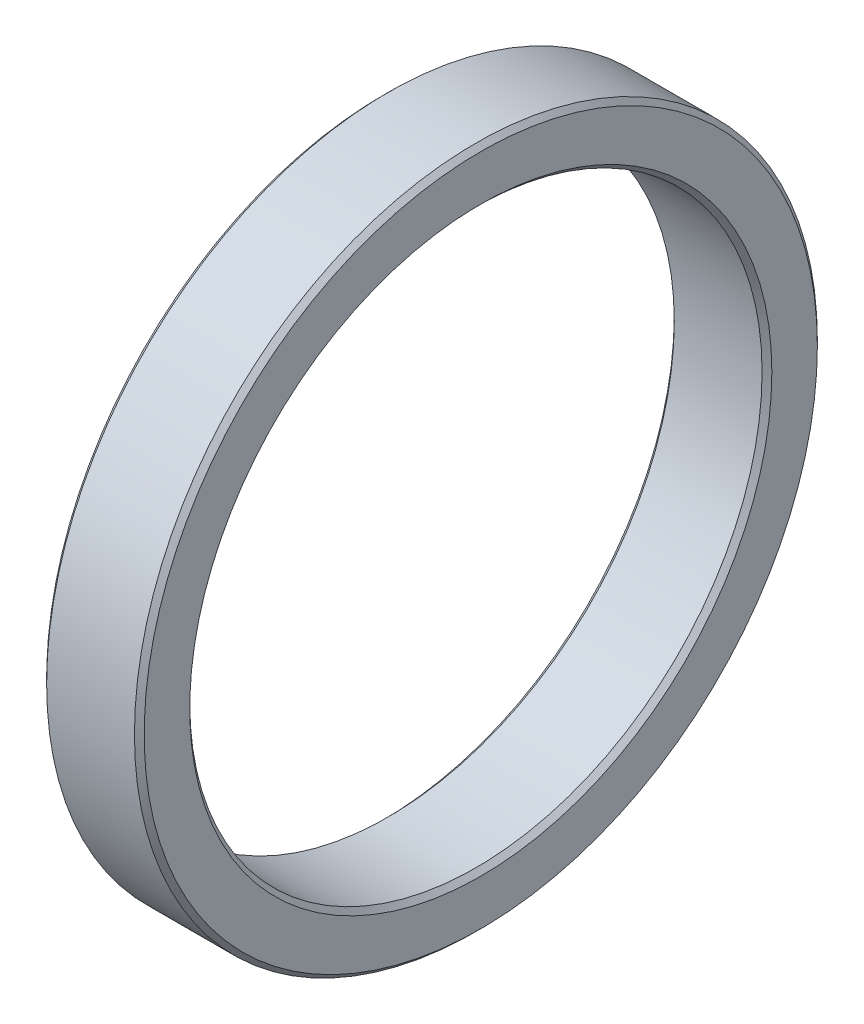
ISO-10303-21;
HEADER;
FILE_DESCRIPTION(('STEP AP214'),'2;1');
FILE_NAME('part.step','',(''),(''),'','','');
FILE_SCHEMA(('AUTOMOTIVE_DESIGN { 1 0 10303 214 1 1 1 1 }'));
ENDSEC;
DATA;
#1=APPLICATION_CONTEXT('core data for automotive mechanical design processes');
#2=APPLICATION_PROTOCOL_DEFINITION('international standard','automotive_design',2000,#1);
#3=PRODUCT_CONTEXT('',#1,'mechanical');
#4=PRODUCT('Part','Part','',(#3));
#5=PRODUCT_RELATED_PRODUCT_CATEGORY('part','',(#4));
#6=PRODUCT_DEFINITION_FORMATION('','',#4);
#7=PRODUCT_DEFINITION_CONTEXT('part definition',#1,'design');
#8=PRODUCT_DEFINITION('design','',#6,#7);
#9=PRODUCT_DEFINITION_SHAPE('','',#8);
#10=(LENGTH_UNIT() NAMED_UNIT(*) SI_UNIT(.MILLI.,.METRE.));
#11=(NAMED_UNIT(*) PLANE_ANGLE_UNIT() SI_UNIT($,.RADIAN.));
#12=(NAMED_UNIT(*) SI_UNIT($,.STERADIAN.) SOLID_ANGLE_UNIT());
#13=UNCERTAINTY_MEASURE_WITH_UNIT(LENGTH_MEASURE(1.E-05),#10,'distance_accuracy_value','');
#14=(GEOMETRIC_REPRESENTATION_CONTEXT(3) GLOBAL_UNCERTAINTY_ASSIGNED_CONTEXT((#13)) GLOBAL_UNIT_ASSIGNED_CONTEXT((#10,
#11,#12)) REPRESENTATION_CONTEXT('',''));
#15=CARTESIAN_POINT('',(0.,0.,0.));
#16=DIRECTION('',(0.,0.,1.));
#17=DIRECTION('',(1.,0.,0.));
#18=AXIS2_PLACEMENT_3D('',#15,#16,#17);
#19=CARTESIAN_POINT('',(6.,0.,0.));
#20=DIRECTION('',(1.,0.,0.));
#21=DIRECTION('',(0.,0.,-1.));
#22=AXIS2_PLACEMENT_3D('',#19,#20,#21);
#23=PLANE('',#22);
#24=CARTESIAN_POINT('',(6.,0.,0.));
#25=DIRECTION('',(1.,0.,0.));
#26=DIRECTION('',(0.,0.,-1.));
#27=AXIS2_PLACEMENT_3D('',#24,#25,#26);
#28=CIRCLE('',#27,17.9);
#29=CARTESIAN_POINT('',(6.,0.,-17.9));
#30=VERTEX_POINT('',#29);
#31=EDGE_CURVE('E47',#30,#30,#28,.F.);
#32=ORIENTED_EDGE('',*,*,#31,.T.);
#33=EDGE_LOOP('',(#32));
#34=FACE_BOUND('',#33,.T.);
#35=CARTESIAN_POINT('',(6.,0.,0.));
#36=DIRECTION('',(1.,0.,0.));
#37=DIRECTION('',(0.,0.,-1.));
#38=AXIS2_PLACEMENT_3D('',#35,#36,#37);
#39=CIRCLE('',#38,20.7);
#40=CARTESIAN_POINT('',(6.,0.,-20.7));
#41=VERTEX_POINT('',#40);
#42=EDGE_CURVE('E51',#41,#41,#39,.T.);
#43=ORIENTED_EDGE('',*,*,#42,.T.);
#44=EDGE_LOOP('',(#43));
#45=FACE_BOUND('',#44,.T.);
#46=ADVANCED_FACE('F35',(#34,#45),#23,.T.);
#47=CARTESIAN_POINT('',(0.,0.,0.));
#48=DIRECTION('',(1.,0.,0.));
#49=DIRECTION('',(0.,0.,-1.));
#50=AXIS2_PLACEMENT_3D('',#47,#48,#49);
#51=PLANE('',#50);
#52=CARTESIAN_POINT('',(0.,0.,0.));
#53=DIRECTION('',(1.,0.,0.));
#54=DIRECTION('',(0.,0.,-1.));
#55=AXIS2_PLACEMENT_3D('',#52,#53,#54);
#56=CIRCLE('',#55,17.9);
#57=CARTESIAN_POINT('',(0.,0.,-17.9));
#58=VERTEX_POINT('',#57);
#59=EDGE_CURVE('E62',#58,#58,#56,.T.);
#60=ORIENTED_EDGE('',*,*,#59,.T.);
#61=EDGE_LOOP('',(#60));
#62=FACE_BOUND('',#61,.T.);
#63=CARTESIAN_POINT('',(0.,0.,0.));
#64=DIRECTION('',(1.,0.,0.));
#65=DIRECTION('',(0.,0.,-1.));
#66=AXIS2_PLACEMENT_3D('',#63,#64,#65);
#67=CIRCLE('',#66,20.7);
#68=CARTESIAN_POINT('',(0.,0.,-20.7));
#69=VERTEX_POINT('',#68);
#70=EDGE_CURVE('E65',#69,#69,#67,.F.);
#71=ORIENTED_EDGE('',*,*,#70,.T.);
#72=EDGE_LOOP('',(#71));
#73=FACE_BOUND('',#72,.T.);
#74=ADVANCED_FACE('F69',(#62,#73),#51,.F.);
#75=CARTESIAN_POINT('',(6.,0.,0.));
#76=DIRECTION('',(-1.,0.,0.));
#77=DIRECTION('',(0.,0.,1.));
#78=AXIS2_PLACEMENT_3D('',#75,#76,#77);
#79=CYLINDRICAL_SURFACE('',#78,21.);
#80=CARTESIAN_POINT('',(0.299999999999995,0.,0.));
#81=DIRECTION('',(1.,0.,0.));
#82=DIRECTION('',(0.,0.,-1.));
#83=AXIS2_PLACEMENT_3D('',#80,#81,#82);
#84=CIRCLE('',#83,21.);
#85=CARTESIAN_POINT('',(0.299999999999995,0.,-21.));
#86=VERTEX_POINT('',#85);
#87=EDGE_CURVE('E10',#86,#86,#84,.T.);
#88=ORIENTED_EDGE('',*,*,#87,.T.);
#89=EDGE_LOOP('',(#88));
#90=FACE_BOUND('',#89,.T.);
#91=CARTESIAN_POINT('',(5.7,0.,0.));
#92=DIRECTION('',(1.,0.,0.));
#93=DIRECTION('',(0.,0.,-1.));
#94=AXIS2_PLACEMENT_3D('',#91,#92,#93);
#95=CIRCLE('',#94,21.);
#96=CARTESIAN_POINT('',(5.7,0.,-21.));
#97=VERTEX_POINT('',#96);
#98=EDGE_CURVE('E43',#97,#97,#95,.F.);
#99=ORIENTED_EDGE('',*,*,#98,.T.);
#100=EDGE_LOOP('',(#99));
#101=FACE_BOUND('',#100,.T.);
#102=ADVANCED_FACE('F90',(#90,#101),#79,.T.);
#103=CARTESIAN_POINT('',(6.,0.,0.));
#104=DIRECTION('',(-1.,0.,0.));
#105=DIRECTION('',(0.,0.,1.));
#106=AXIS2_PLACEMENT_3D('',#103,#104,#105);
#107=CYLINDRICAL_SURFACE('',#106,17.6);
#108=CARTESIAN_POINT('',(0.299999999999998,0.,0.));
#109=DIRECTION('',(1.,0.,0.));
#110=DIRECTION('',(0.,0.,-1.));
#111=AXIS2_PLACEMENT_3D('',#108,#109,#110);
#112=CIRCLE('',#111,17.6);
#113=CARTESIAN_POINT('',(0.299999999999998,0.,-17.6));
#114=VERTEX_POINT('',#113);
#115=EDGE_CURVE('E56',#114,#114,#112,.F.);
#116=ORIENTED_EDGE('',*,*,#115,.T.);
#117=EDGE_LOOP('',(#116));
#118=FACE_BOUND('',#117,.T.);
#119=CARTESIAN_POINT('',(5.70000000000001,0.,0.));
#120=DIRECTION('',(1.,0.,0.));
#121=DIRECTION('',(0.,0.,-1.));
#122=AXIS2_PLACEMENT_3D('',#119,#120,#121);
#123=CIRCLE('',#122,17.6);
#124=CARTESIAN_POINT('',(5.70000000000001,0.,-17.6));
#125=VERTEX_POINT('',#124);
#126=EDGE_CURVE('E59',#125,#125,#123,.T.);
#127=ORIENTED_EDGE('',*,*,#126,.T.);
#128=EDGE_LOOP('',(#127));
#129=FACE_BOUND('',#128,.T.);
#130=ADVANCED_FACE('F95',(#118,#129),#107,.F.);
#131=CARTESIAN_POINT('',(0.,0.,0.));
#132=DIRECTION('',(-1.,0.,0.));
#133=DIRECTION('',(0.,0.,1.));
#134=AXIS2_PLACEMENT_3D('',#131,#132,#133);
#135=CONICAL_SURFACE('',#134,17.9,0.785398163397448);
#136=ORIENTED_EDGE('',*,*,#115,.F.);
#137=EDGE_LOOP('',(#136));
#138=FACE_BOUND('',#137,.T.);
#139=ORIENTED_EDGE('',*,*,#59,.F.);
#140=EDGE_LOOP('',(#139));
#141=FACE_BOUND('',#140,.T.);
#142=ADVANCED_FACE('F80',(#138,#141),#135,.F.);
#143=CARTESIAN_POINT('',(5.70000000000001,0.,0.));
#144=DIRECTION('',(1.,0.,0.));
#145=DIRECTION('',(0.,0.,-1.));
#146=AXIS2_PLACEMENT_3D('',#143,#144,#145);
#147=CONICAL_SURFACE('',#146,17.6,0.785398163397454);
#148=ORIENTED_EDGE('',*,*,#31,.F.);
#149=EDGE_LOOP('',(#148));
#150=FACE_BOUND('',#149,.T.);
#151=ORIENTED_EDGE('',*,*,#126,.F.);
#152=EDGE_LOOP('',(#151));
#153=FACE_BOUND('',#152,.T.);
#154=ADVANCED_FACE('F74',(#150,#153),#147,.F.);
#155=CARTESIAN_POINT('',(0.299999999999995,0.,0.));
#156=DIRECTION('',(1.,0.,0.));
#157=DIRECTION('',(0.,0.,-1.));
#158=AXIS2_PLACEMENT_3D('',#155,#156,#157);
#159=CONICAL_SURFACE('',#158,21.,0.785398163397454);
#160=ORIENTED_EDGE('',*,*,#70,.F.);
#161=EDGE_LOOP('',(#160));
#162=FACE_BOUND('',#161,.T.);
#163=ORIENTED_EDGE('',*,*,#87,.F.);
#164=EDGE_LOOP('',(#163));
#165=FACE_BOUND('',#164,.T.);
#166=ADVANCED_FACE('F71',(#162,#165),#159,.T.);
#167=CARTESIAN_POINT('',(6.,0.,0.));
#168=DIRECTION('',(-1.,0.,0.));
#169=DIRECTION('',(0.,0.,1.));
#170=AXIS2_PLACEMENT_3D('',#167,#168,#169);
#171=CONICAL_SURFACE('',#170,20.7,0.785398163397448);
#172=ORIENTED_EDGE('',*,*,#98,.F.);
#173=EDGE_LOOP('',(#172));
#174=FACE_BOUND('',#173,.T.);
#175=ORIENTED_EDGE('',*,*,#42,.F.);
#176=EDGE_LOOP('',(#175));
#177=FACE_BOUND('',#176,.T.);
#178=ADVANCED_FACE('F38',(#174,#177),#171,.T.);
#179=CLOSED_SHELL('',(#46,#74,#102,#130,#142,#154,#166,#178));
#180=MANIFOLD_SOLID_BREP('B2',#179);
#181=ADVANCED_BREP_SHAPE_REPRESENTATION('',(#18,#180),#14);
#182=SHAPE_DEFINITION_REPRESENTATION(#9,#181);
ENDSEC;
END-ISO-10303-21;
